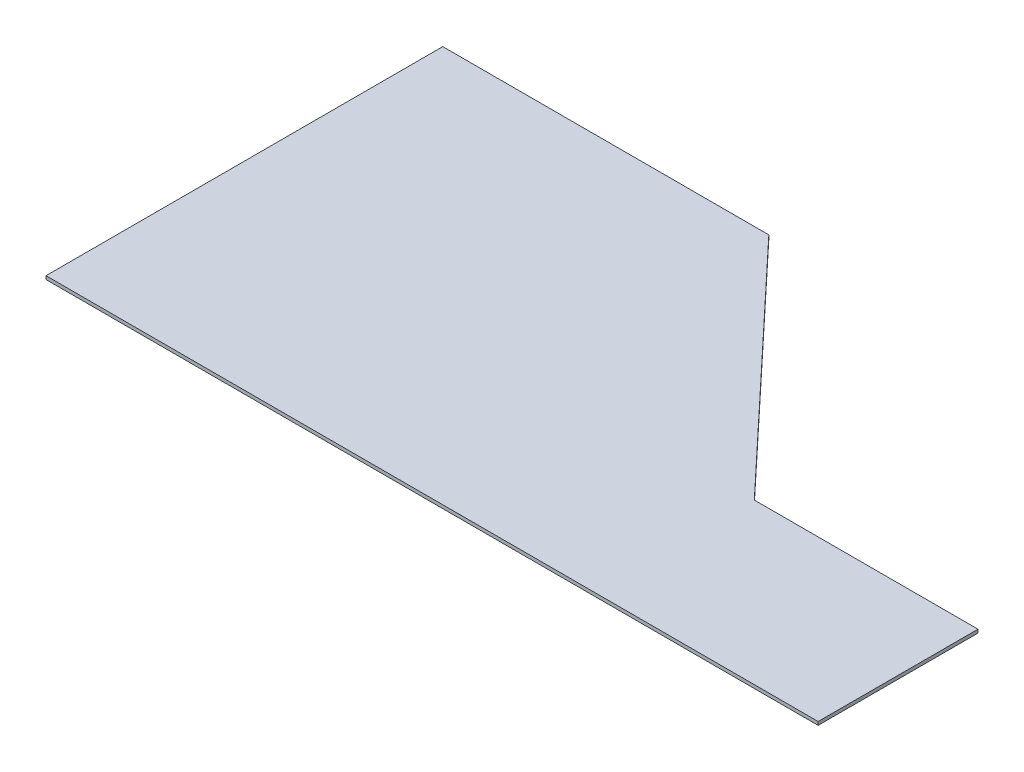
ISO-10303-21;
HEADER;
FILE_DESCRIPTION(('STEP AP214'),'2;1');
FILE_NAME('part.step','',(''),(''),'','','');
FILE_SCHEMA(('AUTOMOTIVE_DESIGN { 1 0 10303 214 1 1 1 1 }'));
ENDSEC;
DATA;
#1=APPLICATION_CONTEXT('core data for automotive mechanical design processes');
#2=APPLICATION_PROTOCOL_DEFINITION('international standard','automotive_design',2000,#1);
#3=PRODUCT_CONTEXT('',#1,'mechanical');
#4=PRODUCT('Part','Part','',(#3));
#5=PRODUCT_RELATED_PRODUCT_CATEGORY('part','',(#4));
#6=PRODUCT_DEFINITION_FORMATION('','',#4);
#7=PRODUCT_DEFINITION_CONTEXT('part definition',#1,'design');
#8=PRODUCT_DEFINITION('design','',#6,#7);
#9=PRODUCT_DEFINITION_SHAPE('','',#8);
#10=(LENGTH_UNIT() NAMED_UNIT(*) SI_UNIT(.MILLI.,.METRE.));
#11=(NAMED_UNIT(*) PLANE_ANGLE_UNIT() SI_UNIT($,.RADIAN.));
#12=(NAMED_UNIT(*) SI_UNIT($,.STERADIAN.) SOLID_ANGLE_UNIT());
#13=UNCERTAINTY_MEASURE_WITH_UNIT(LENGTH_MEASURE(1.E-05),#10,'distance_accuracy_value','');
#14=(GEOMETRIC_REPRESENTATION_CONTEXT(3) GLOBAL_UNCERTAINTY_ASSIGNED_CONTEXT((#13)) GLOBAL_UNIT_ASSIGNED_CONTEXT((#10,
#11,#12)) REPRESENTATION_CONTEXT('',''));
#15=CARTESIAN_POINT('',(0.,0.,0.));
#16=DIRECTION('',(0.,0.,1.));
#17=DIRECTION('',(1.,0.,0.));
#18=AXIS2_PLACEMENT_3D('',#15,#16,#17);
#19=CARTESIAN_POINT('',(280.,-51.,128.442125645559));
#20=DIRECTION('',(0.,0.,-1.));
#21=DIRECTION('',(-1.,0.,0.));
#22=AXIS2_PLACEMENT_3D('',#19,#20,#21);
#23=PLANE('',#22);
#24=DIRECTION('',(-1.,0.,0.));
#25=VECTOR('',#24,1.);
#26=CARTESIAN_POINT('',(280.,-50.,128.442125645559));
#27=LINE('',#26,#25);
#28=CARTESIAN_POINT('',(280.,-50.,128.442125645559));
#29=VERTEX_POINT('',#28);
#30=CARTESIAN_POINT('',(51.,-50.,128.442125645559));
#31=VERTEX_POINT('',#30);
#32=EDGE_CURVE('E122',#29,#31,#27,.T.);
#33=ORIENTED_EDGE('',*,*,#32,.T.);
#34=DIRECTION('',(0.,1.,0.));
#35=VECTOR('',#34,1.);
#36=CARTESIAN_POINT('',(51.,-51.,128.442125645559));
#37=LINE('',#36,#35);
#38=CARTESIAN_POINT('',(51.,-51.,128.442125645559));
#39=VERTEX_POINT('',#38);
#40=EDGE_CURVE('E11',#39,#31,#37,.T.);
#41=ORIENTED_EDGE('',*,*,#40,.F.);
#42=DIRECTION('',(-1.,0.,0.));
#43=VECTOR('',#42,1.);
#44=CARTESIAN_POINT('',(280.,-51.,128.442125645559));
#45=LINE('',#44,#43);
#46=CARTESIAN_POINT('',(280.,-51.,128.442125645559));
#47=VERTEX_POINT('',#46);
#48=EDGE_CURVE('E132',#47,#39,#45,.T.);
#49=ORIENTED_EDGE('',*,*,#48,.F.);
#50=DIRECTION('',(0.,1.,0.));
#51=VECTOR('',#50,1.);
#52=CARTESIAN_POINT('',(280.,-51.,128.442125645559));
#53=LINE('',#52,#51);
#54=EDGE_CURVE('E118',#47,#29,#53,.T.);
#55=ORIENTED_EDGE('',*,*,#54,.T.);
#56=EDGE_LOOP('',(#33,#41,#49,#55));
#57=FACE_BOUND('',#56,.T.);
#58=ADVANCED_FACE('F38',(#57),#23,.F.);
#59=CARTESIAN_POINT('',(51.,-51.,128.442125645559));
#60=DIRECTION('',(1.,0.,0.));
#61=DIRECTION('',(0.,0.,-1.));
#62=AXIS2_PLACEMENT_3D('',#59,#60,#61);
#63=PLANE('',#62);
#64=DIRECTION('',(0.,0.,-1.));
#65=VECTOR('',#64,1.);
#66=CARTESIAN_POINT('',(51.,-50.,128.442125645559));
#67=LINE('',#66,#65);
#68=CARTESIAN_POINT('',(51.,-50.,10.7712382075354));
#69=VERTEX_POINT('',#68);
#70=EDGE_CURVE('E125',#31,#69,#67,.T.);
#71=ORIENTED_EDGE('',*,*,#70,.T.);
#72=DIRECTION('',(0.,1.,0.));
#73=VECTOR('',#72,1.);
#74=CARTESIAN_POINT('',(51.,-51.,10.7712382075354));
#75=LINE('',#74,#73);
#76=CARTESIAN_POINT('',(51.,-51.,10.7712382075354));
#77=VERTEX_POINT('',#76);
#78=EDGE_CURVE('E46',#77,#69,#75,.T.);
#79=ORIENTED_EDGE('',*,*,#78,.F.);
#80=DIRECTION('',(0.,0.,-1.));
#81=VECTOR('',#80,1.);
#82=CARTESIAN_POINT('',(51.,-51.,128.442125645559));
#83=LINE('',#82,#81);
#84=EDGE_CURVE('E91',#39,#77,#83,.T.);
#85=ORIENTED_EDGE('',*,*,#84,.F.);
#86=ORIENTED_EDGE('',*,*,#40,.T.);
#87=EDGE_LOOP('',(#71,#79,#85,#86));
#88=FACE_BOUND('',#87,.T.);
#89=ADVANCED_FACE('F156',(#88),#63,.F.);
#90=CARTESIAN_POINT('',(51.,-51.,10.7712382075354));
#91=DIRECTION('',(0.,0.,1.));
#92=DIRECTION('',(1.,0.,0.));
#93=AXIS2_PLACEMENT_3D('',#90,#91,#92);
#94=PLANE('',#93);
#95=DIRECTION('',(1.,0.,0.));
#96=VECTOR('',#95,1.);
#97=CARTESIAN_POINT('',(51.,-50.,10.7712382075354));
#98=LINE('',#97,#96);
#99=CARTESIAN_POINT('',(147.705868366748,-50.,10.7712382075354));
#100=VERTEX_POINT('',#99);
#101=EDGE_CURVE('E127',#69,#100,#98,.T.);
#102=ORIENTED_EDGE('',*,*,#101,.T.);
#103=DIRECTION('',(0.,1.,0.));
#104=VECTOR('',#103,1.);
#105=CARTESIAN_POINT('',(147.705868366748,-51.,10.7712382075354));
#106=LINE('',#105,#104);
#107=CARTESIAN_POINT('',(147.705868366748,-51.,10.7712382075354));
#108=VERTEX_POINT('',#107);
#109=EDGE_CURVE('E113',#108,#100,#106,.T.);
#110=ORIENTED_EDGE('',*,*,#109,.F.);
#111=DIRECTION('',(1.,0.,0.));
#112=VECTOR('',#111,1.);
#113=CARTESIAN_POINT('',(51.,-51.,10.7712382075354));
#114=LINE('',#113,#112);
#115=EDGE_CURVE('E104',#77,#108,#114,.T.);
#116=ORIENTED_EDGE('',*,*,#115,.F.);
#117=ORIENTED_EDGE('',*,*,#78,.T.);
#118=EDGE_LOOP('',(#102,#110,#116,#117));
#119=FACE_BOUND('',#118,.T.);
#120=ADVANCED_FACE('F138',(#119),#94,.F.);
#121=CARTESIAN_POINT('',(147.705868366748,-51.,10.7712382075354));
#122=DIRECTION('',(-0.729124004211731,0.,0.684381608813571));
#123=DIRECTION('',(0.684381608813571,0.,0.729124004211731));
#124=AXIS2_PLACEMENT_3D('',#121,#122,#123);
#125=PLANE('',#124);
#126=DIRECTION('',(0.684381608813571,0.,0.729124004211731));
#127=VECTOR('',#126,1.);
#128=CARTESIAN_POINT('',(147.705868366748,-50.,10.7712382075354));
#129=LINE('',#128,#127);
#130=CARTESIAN_POINT('',(213.658520423811,-50.,81.035636223129));
#131=VERTEX_POINT('',#130);
#132=EDGE_CURVE('E112',#100,#131,#129,.T.);
#133=ORIENTED_EDGE('',*,*,#132,.T.);
#134=DIRECTION('',(0.,1.,0.));
#135=VECTOR('',#134,1.);
#136=CARTESIAN_POINT('',(213.658520423811,-51.,81.035636223129));
#137=LINE('',#136,#135);
#138=CARTESIAN_POINT('',(213.658520423811,-51.,81.035636223129));
#139=VERTEX_POINT('',#138);
#140=EDGE_CURVE('E109',#139,#131,#137,.T.);
#141=ORIENTED_EDGE('',*,*,#140,.F.);
#142=DIRECTION('',(0.684381608813571,0.,0.729124004211731));
#143=VECTOR('',#142,1.);
#144=CARTESIAN_POINT('',(147.705868366748,-51.,10.7712382075354));
#145=LINE('',#144,#143);
#146=EDGE_CURVE('E98',#108,#139,#145,.T.);
#147=ORIENTED_EDGE('',*,*,#146,.F.);
#148=ORIENTED_EDGE('',*,*,#109,.T.);
#149=EDGE_LOOP('',(#133,#141,#147,#148));
#150=FACE_BOUND('',#149,.T.);
#151=ADVANCED_FACE('F110',(#150),#125,.F.);
#152=CARTESIAN_POINT('',(213.658520423811,-51.,81.035636223129));
#153=DIRECTION('',(0.,0.,1.));
#154=DIRECTION('',(1.,0.,0.));
#155=AXIS2_PLACEMENT_3D('',#152,#153,#154);
#156=PLANE('',#155);
#157=DIRECTION('',(1.,0.,0.));
#158=VECTOR('',#157,1.);
#159=CARTESIAN_POINT('',(213.658520423811,-50.,81.035636223129));
#160=LINE('',#159,#158);
#161=CARTESIAN_POINT('',(280.,-50.,81.035636223129));
#162=VERTEX_POINT('',#161);
#163=EDGE_CURVE('E77',#131,#162,#160,.T.);
#164=ORIENTED_EDGE('',*,*,#163,.T.);
#165=DIRECTION('',(0.,1.,0.));
#166=VECTOR('',#165,1.);
#167=CARTESIAN_POINT('',(280.,-51.,81.035636223129));
#168=LINE('',#167,#166);
#169=CARTESIAN_POINT('',(280.,-51.,81.035636223129));
#170=VERTEX_POINT('',#169);
#171=EDGE_CURVE('E114',#170,#162,#168,.T.);
#172=ORIENTED_EDGE('',*,*,#171,.F.);
#173=DIRECTION('',(1.,0.,0.));
#174=VECTOR('',#173,1.);
#175=CARTESIAN_POINT('',(213.658520423811,-51.,81.035636223129));
#176=LINE('',#175,#174);
#177=EDGE_CURVE('E102',#139,#170,#176,.T.);
#178=ORIENTED_EDGE('',*,*,#177,.F.);
#179=ORIENTED_EDGE('',*,*,#140,.T.);
#180=EDGE_LOOP('',(#164,#172,#178,#179));
#181=FACE_BOUND('',#180,.T.);
#182=ADVANCED_FACE('F116',(#181),#156,.F.);
#183=CARTESIAN_POINT('',(280.,-51.,81.035636223129));
#184=DIRECTION('',(-1.,0.,0.));
#185=DIRECTION('',(0.,0.,1.));
#186=AXIS2_PLACEMENT_3D('',#183,#184,#185);
#187=PLANE('',#186);
#188=DIRECTION('',(0.,0.,1.));
#189=VECTOR('',#188,1.);
#190=CARTESIAN_POINT('',(280.,-50.,81.035636223129));
#191=LINE('',#190,#189);
#192=EDGE_CURVE('E83',#162,#29,#191,.T.);
#193=ORIENTED_EDGE('',*,*,#192,.T.);
#194=ORIENTED_EDGE('',*,*,#54,.F.);
#195=DIRECTION('',(0.,0.,1.));
#196=VECTOR('',#195,1.);
#197=CARTESIAN_POINT('',(280.,-51.,81.035636223129));
#198=LINE('',#197,#196);
#199=EDGE_CURVE('E54',#170,#47,#198,.T.);
#200=ORIENTED_EDGE('',*,*,#199,.F.);
#201=ORIENTED_EDGE('',*,*,#171,.T.);
#202=EDGE_LOOP('',(#193,#194,#200,#201));
#203=FACE_BOUND('',#202,.T.);
#204=ADVANCED_FACE('F145',(#203),#187,.F.);
#205=CARTESIAN_POINT('',(0.,-51.,0.));
#206=DIRECTION('',(0.,-1.,0.));
#207=DIRECTION('',(0.,0.,-1.));
#208=AXIS2_PLACEMENT_3D('',#205,#206,#207);
#209=PLANE('',#208);
#210=ORIENTED_EDGE('',*,*,#48,.T.);
#211=ORIENTED_EDGE('',*,*,#84,.T.);
#212=ORIENTED_EDGE('',*,*,#115,.T.);
#213=ORIENTED_EDGE('',*,*,#146,.T.);
#214=ORIENTED_EDGE('',*,*,#177,.T.);
#215=ORIENTED_EDGE('',*,*,#199,.T.);
#216=EDGE_LOOP('',(#210,#211,#212,#213,#214,#215));
#217=FACE_BOUND('',#216,.T.);
#218=ADVANCED_FACE('F100',(#217),#209,.T.);
#219=CARTESIAN_POINT('',(0.,-50.,0.));
#220=DIRECTION('',(0.,-1.,0.));
#221=DIRECTION('',(0.,0.,-1.));
#222=AXIS2_PLACEMENT_3D('',#219,#220,#221);
#223=PLANE('',#222);
#224=ORIENTED_EDGE('',*,*,#32,.F.);
#225=ORIENTED_EDGE('',*,*,#192,.F.);
#226=ORIENTED_EDGE('',*,*,#163,.F.);
#227=ORIENTED_EDGE('',*,*,#132,.F.);
#228=ORIENTED_EDGE('',*,*,#101,.F.);
#229=ORIENTED_EDGE('',*,*,#70,.F.);
#230=EDGE_LOOP('',(#224,#225,#226,#227,#228,#229));
#231=FACE_BOUND('',#230,.T.);
#232=ADVANCED_FACE('F141',(#231),#223,.F.);
#233=CLOSED_SHELL('',(#58,#89,#120,#151,#182,#204,#218,#232));
#234=MANIFOLD_SOLID_BREP('B2',#233);
#235=ADVANCED_BREP_SHAPE_REPRESENTATION('',(#18,#234),#14);
#236=SHAPE_DEFINITION_REPRESENTATION(#9,#235);
ENDSEC;
END-ISO-10303-21;
